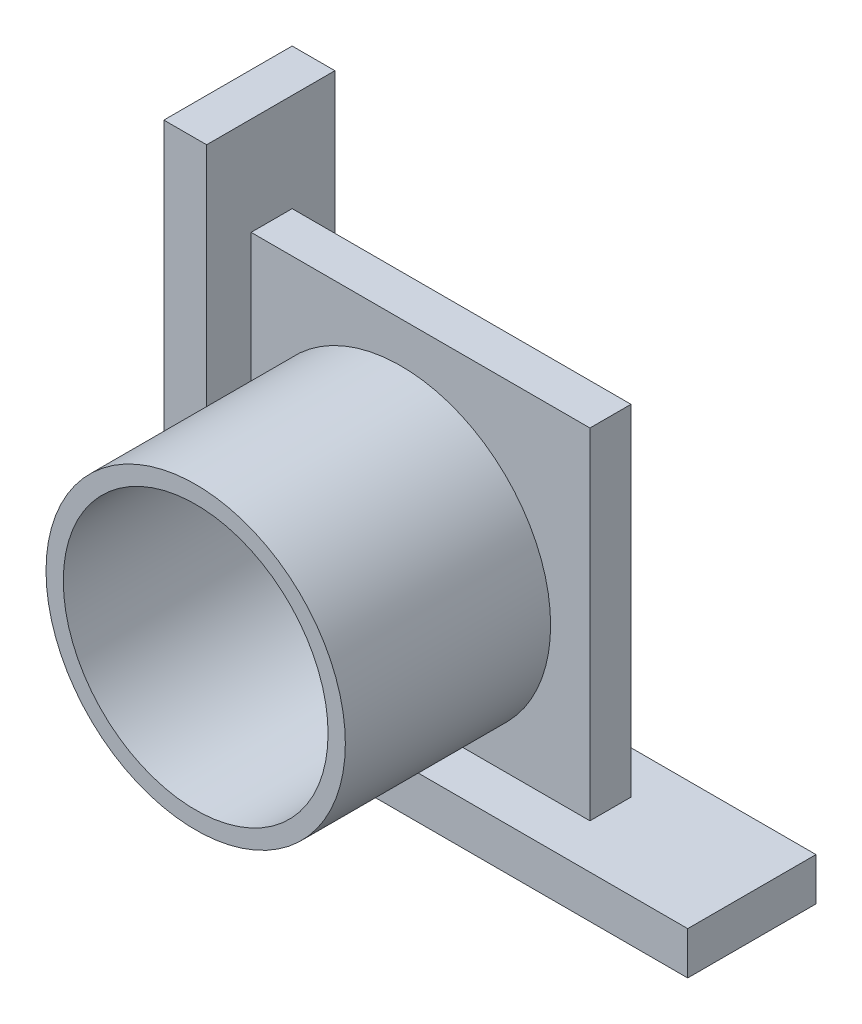
ISO-10303-21;
HEADER;
FILE_DESCRIPTION(('STEP AP214'),'2;1');
FILE_NAME('part.step','',(''),(''),'','','');
FILE_SCHEMA(('AUTOMOTIVE_DESIGN { 1 0 10303 214 1 1 1 1 }'));
ENDSEC;
DATA;
#1=APPLICATION_CONTEXT('core data for automotive mechanical design processes');
#2=APPLICATION_PROTOCOL_DEFINITION('international standard','automotive_design',2000,#1);
#3=PRODUCT_CONTEXT('',#1,'mechanical');
#4=PRODUCT('Part','Part','',(#3));
#5=PRODUCT_RELATED_PRODUCT_CATEGORY('part','',(#4));
#6=PRODUCT_DEFINITION_FORMATION('','',#4);
#7=PRODUCT_DEFINITION_CONTEXT('part definition',#1,'design');
#8=PRODUCT_DEFINITION('design','',#6,#7);
#9=PRODUCT_DEFINITION_SHAPE('','',#8);
#10=(LENGTH_UNIT() NAMED_UNIT(*) SI_UNIT(.MILLI.,.METRE.));
#11=(NAMED_UNIT(*) PLANE_ANGLE_UNIT() SI_UNIT($,.RADIAN.));
#12=(NAMED_UNIT(*) SI_UNIT($,.STERADIAN.) SOLID_ANGLE_UNIT());
#13=UNCERTAINTY_MEASURE_WITH_UNIT(LENGTH_MEASURE(1.E-05),#10,'distance_accuracy_value','');
#14=(GEOMETRIC_REPRESENTATION_CONTEXT(3) GLOBAL_UNCERTAINTY_ASSIGNED_CONTEXT((#13)) GLOBAL_UNIT_ASSIGNED_CONTEXT((#10,
#11,#12)) REPRESENTATION_CONTEXT('',''));
#15=CARTESIAN_POINT('',(0.,0.,0.));
#16=DIRECTION('',(0.,0.,1.));
#17=DIRECTION('',(1.,0.,0.));
#18=AXIS2_PLACEMENT_3D('',#15,#16,#17);
#19=CARTESIAN_POINT('',(12.7,113.7412,24.892));
#20=DIRECTION('',(0.,0.,-1.));
#21=DIRECTION('',(0.,1.,0.));
#22=AXIS2_PLACEMENT_3D('',#19,#20,#21);
#23=PLANE('',#22);
#24=CARTESIAN_POINT('',(57.2008,57.2008,24.892));
#25=DIRECTION('',(0.,0.,-1.));
#26=DIRECTION('',(0.,1.,0.));
#27=AXIS2_PLACEMENT_3D('',#24,#25,#26);
#28=CIRCLE('',#27,39.3192);
#29=CARTESIAN_POINT('',(53.0149568799239,18.1050431200762,24.892));
#30=VERTEX_POINT('',#29);
#31=CARTESIAN_POINT('',(18.1050431200762,53.0149568799239,24.892));
#32=VERTEX_POINT('',#31);
#33=EDGE_CURVE('E160',#30,#32,#28,.F.);
#34=ORIENTED_EDGE('',*,*,#33,.T.);
#35=DIRECTION('',(-0.707106781186548,0.707106781186548,0.));
#36=VECTOR('',#35,1.);
#37=CARTESIAN_POINT('',(12.7,58.42,24.892));
#38=LINE('',#37,#36);
#39=EDGE_CURVE('E138',#30,#32,#38,.T.);
#40=ORIENTED_EDGE('',*,*,#39,.F.);
#41=EDGE_LOOP('',(#34,#40));
#42=FACE_BOUND('',#41,.T.);
#43=ADVANCED_FACE('F33',(#42),#23,.F.);
#44=CARTESIAN_POINT('',(155.575,12.7,0.));
#45=DIRECTION('',(0.,1.,0.));
#46=DIRECTION('',(0.,0.,1.));
#47=AXIS2_PLACEMENT_3D('',#44,#45,#46);
#48=PLANE('',#47);
#49=DIRECTION('',(1.,0.,0.));
#50=VECTOR('',#49,1.);
#51=CARTESIAN_POINT('',(12.7,12.7,24.892));
#52=LINE('',#51,#50);
#53=CARTESIAN_POINT('',(58.42,12.7,24.892));
#54=VERTEX_POINT('',#53);
#55=CARTESIAN_POINT('',(113.3348,12.7,24.892));
#56=VERTEX_POINT('',#55);
#57=EDGE_CURVE('E166',#54,#56,#52,.T.);
#58=ORIENTED_EDGE('',*,*,#57,.F.);
#59=DIRECTION('',(0.,0.,1.));
#60=VECTOR('',#59,1.);
#61=CARTESIAN_POINT('',(58.42,12.7,-51.9578440716979));
#62=LINE('',#61,#60);
#63=CARTESIAN_POINT('',(58.42,12.7,12.7));
#64=VERTEX_POINT('',#63);
#65=EDGE_CURVE('E58',#64,#54,#62,.T.);
#66=ORIENTED_EDGE('',*,*,#65,.F.);
#67=DIRECTION('',(-1.,0.,0.));
#68=VECTOR('',#67,1.);
#69=CARTESIAN_POINT('',(12.7,12.7,12.7));
#70=LINE('',#69,#68);
#71=CARTESIAN_POINT('',(113.3348,12.7,12.7));
#72=VERTEX_POINT('',#71);
#73=EDGE_CURVE('E179',#72,#64,#70,.T.);
#74=ORIENTED_EDGE('',*,*,#73,.F.);
#75=DIRECTION('',(0.,0.,-1.));
#76=VECTOR('',#75,1.);
#77=CARTESIAN_POINT('',(113.3348,12.7,12.7));
#78=LINE('',#77,#76);
#79=EDGE_CURVE('E169',#56,#72,#78,.T.);
#80=ORIENTED_EDGE('',*,*,#79,.F.);
#81=EDGE_LOOP('',(#58,#66,#74,#80));
#82=FACE_BOUND('',#81,.T.);
#83=DIRECTION('',(-1.,0.,0.));
#84=VECTOR('',#83,1.);
#85=CARTESIAN_POINT('',(155.575,12.7,0.));
#86=LINE('',#85,#84);
#87=CARTESIAN_POINT('',(155.575,12.7,0.));
#88=VERTEX_POINT('',#87);
#89=CARTESIAN_POINT('',(12.7,12.7,0.));
#90=VERTEX_POINT('',#89);
#91=EDGE_CURVE('E42',#88,#90,#86,.T.);
#92=ORIENTED_EDGE('',*,*,#91,.T.);
#93=DIRECTION('',(0.,0.,-1.));
#94=VECTOR('',#93,1.);
#95=CARTESIAN_POINT('',(12.7,12.7,0.));
#96=LINE('',#95,#94);
#97=CARTESIAN_POINT('',(12.7,12.7,38.1));
#98=VERTEX_POINT('',#97);
#99=EDGE_CURVE('E198',#98,#90,#96,.T.);
#100=ORIENTED_EDGE('',*,*,#99,.F.);
#101=DIRECTION('',(-1.,0.,0.));
#102=VECTOR('',#101,1.);
#103=CARTESIAN_POINT('',(155.575,12.7,38.1));
#104=LINE('',#103,#102);
#105=CARTESIAN_POINT('',(155.575,12.7,38.1));
#106=VERTEX_POINT('',#105);
#107=EDGE_CURVE('E237',#106,#98,#104,.T.);
#108=ORIENTED_EDGE('',*,*,#107,.F.);
#109=DIRECTION('',(0.,0.,-1.));
#110=VECTOR('',#109,1.);
#111=CARTESIAN_POINT('',(155.575,12.7,0.));
#112=LINE('',#111,#110);
#113=EDGE_CURVE('E224',#106,#88,#112,.T.);
#114=ORIENTED_EDGE('',*,*,#113,.T.);
#115=EDGE_LOOP('',(#92,#100,#108,#114));
#116=FACE_BOUND('',#115,.T.);
#117=ADVANCED_FACE('F263',(#82,#116),#48,.T.);
#118=CARTESIAN_POINT('',(12.7,142.875,0.));
#119=DIRECTION('',(-1.,0.,0.));
#120=DIRECTION('',(0.,0.,1.));
#121=AXIS2_PLACEMENT_3D('',#118,#119,#120);
#122=PLANE('',#121);
#123=ORIENTED_EDGE('',*,*,#99,.T.);
#124=DIRECTION('',(0.,-1.,0.));
#125=VECTOR('',#124,1.);
#126=CARTESIAN_POINT('',(12.7,142.875,0.));
#127=LINE('',#126,#125);
#128=CARTESIAN_POINT('',(12.7,142.875,0.));
#129=VERTEX_POINT('',#128);
#130=EDGE_CURVE('E209',#129,#90,#127,.T.);
#131=ORIENTED_EDGE('',*,*,#130,.F.);
#132=DIRECTION('',(0.,0.,-1.));
#133=VECTOR('',#132,1.);
#134=CARTESIAN_POINT('',(12.7,142.875,0.));
#135=LINE('',#134,#133);
#136=CARTESIAN_POINT('',(12.7,142.875,38.1));
#137=VERTEX_POINT('',#136);
#138=EDGE_CURVE('E204',#137,#129,#135,.T.);
#139=ORIENTED_EDGE('',*,*,#138,.F.);
#140=DIRECTION('',(0.,-1.,0.));
#141=VECTOR('',#140,1.);
#142=CARTESIAN_POINT('',(12.7,142.875,38.1));
#143=LINE('',#142,#141);
#144=EDGE_CURVE('E213',#137,#98,#143,.T.);
#145=ORIENTED_EDGE('',*,*,#144,.T.);
#146=EDGE_LOOP('',(#123,#131,#139,#145));
#147=FACE_BOUND('',#146,.T.);
#148=DIRECTION('',(0.,-1.,0.));
#149=VECTOR('',#148,1.);
#150=CARTESIAN_POINT('',(12.7,113.7412,24.892));
#151=LINE('',#150,#149);
#152=CARTESIAN_POINT('',(12.7,113.7412,24.892));
#153=VERTEX_POINT('',#152);
#154=CARTESIAN_POINT('',(12.7,58.42,24.892));
#155=VERTEX_POINT('',#154);
#156=EDGE_CURVE('E196',#153,#155,#151,.T.);
#157=ORIENTED_EDGE('',*,*,#156,.F.);
#158=DIRECTION('',(0.,0.,1.));
#159=VECTOR('',#158,1.);
#160=CARTESIAN_POINT('',(12.7,113.7412,12.7));
#161=LINE('',#160,#159);
#162=CARTESIAN_POINT('',(12.7,113.7412,12.7));
#163=VERTEX_POINT('',#162);
#164=EDGE_CURVE('E175',#163,#153,#161,.T.);
#165=ORIENTED_EDGE('',*,*,#164,.F.);
#166=DIRECTION('',(0.,-1.,0.));
#167=VECTOR('',#166,1.);
#168=CARTESIAN_POINT('',(12.7,113.7412,12.7));
#169=LINE('',#168,#167);
#170=CARTESIAN_POINT('',(12.7,58.42,12.7));
#171=VERTEX_POINT('',#170);
#172=EDGE_CURVE('E185',#163,#171,#169,.T.);
#173=ORIENTED_EDGE('',*,*,#172,.T.);
#174=DIRECTION('',(0.,0.,1.));
#175=VECTOR('',#174,1.);
#176=CARTESIAN_POINT('',(12.7,58.42,-51.9578440716979));
#177=LINE('',#176,#175);
#178=EDGE_CURVE('E154',#171,#155,#177,.T.);
#179=ORIENTED_EDGE('',*,*,#178,.T.);
#180=EDGE_LOOP('',(#157,#165,#173,#179));
#181=FACE_BOUND('',#180,.T.);
#182=ADVANCED_FACE('F259',(#147,#181),#122,.F.);
#183=CARTESIAN_POINT('',(155.575,0.,0.));
#184=DIRECTION('',(0.,-1.,0.));
#185=DIRECTION('',(0.,0.,-1.));
#186=AXIS2_PLACEMENT_3D('',#183,#184,#185);
#187=PLANE('',#186);
#188=DIRECTION('',(0.,0.,1.));
#189=VECTOR('',#188,1.);
#190=CARTESIAN_POINT('',(0.,0.,0.));
#191=LINE('',#190,#189);
#192=CARTESIAN_POINT('',(0.,0.,0.));
#193=VERTEX_POINT('',#192);
#194=CARTESIAN_POINT('',(0.,0.,38.1));
#195=VERTEX_POINT('',#194);
#196=EDGE_CURVE('E216',#193,#195,#191,.T.);
#197=ORIENTED_EDGE('',*,*,#196,.F.);
#198=DIRECTION('',(-1.,0.,0.));
#199=VECTOR('',#198,1.);
#200=CARTESIAN_POINT('',(155.575,0.,0.));
#201=LINE('',#200,#199);
#202=CARTESIAN_POINT('',(155.575,0.,0.));
#203=VERTEX_POINT('',#202);
#204=EDGE_CURVE('E11',#203,#193,#201,.T.);
#205=ORIENTED_EDGE('',*,*,#204,.F.);
#206=DIRECTION('',(0.,0.,1.));
#207=VECTOR('',#206,1.);
#208=CARTESIAN_POINT('',(155.575,0.,0.));
#209=LINE('',#208,#207);
#210=CARTESIAN_POINT('',(155.575,0.,38.1));
#211=VERTEX_POINT('',#210);
#212=EDGE_CURVE('E217',#203,#211,#209,.T.);
#213=ORIENTED_EDGE('',*,*,#212,.T.);
#214=DIRECTION('',(-1.,0.,0.));
#215=VECTOR('',#214,1.);
#216=CARTESIAN_POINT('',(155.575,0.,38.1));
#217=LINE('',#216,#215);
#218=EDGE_CURVE('E37',#211,#195,#217,.T.);
#219=ORIENTED_EDGE('',*,*,#218,.T.);
#220=EDGE_LOOP('',(#197,#205,#213,#219));
#221=FACE_BOUND('',#220,.T.);
#222=ADVANCED_FACE('F35',(#221),#187,.T.);
#223=CARTESIAN_POINT('',(155.575,0.,0.));
#224=DIRECTION('',(0.,0.,-1.));
#225=DIRECTION('',(-1.,0.,0.));
#226=AXIS2_PLACEMENT_3D('',#223,#224,#225);
#227=PLANE('',#226);
#228=DIRECTION('',(0.,-1.,0.));
#229=VECTOR('',#228,1.);
#230=CARTESIAN_POINT('',(0.,0.,0.));
#231=LINE('',#230,#229);
#232=CARTESIAN_POINT('',(0.,142.875,0.));
#233=VERTEX_POINT('',#232);
#234=EDGE_CURVE('E221',#233,#193,#231,.T.);
#235=ORIENTED_EDGE('',*,*,#234,.F.);
#236=DIRECTION('',(-1.,0.,0.));
#237=VECTOR('',#236,1.);
#238=CARTESIAN_POINT('',(0.,142.875,0.));
#239=LINE('',#238,#237);
#240=EDGE_CURVE('E206',#129,#233,#239,.T.);
#241=ORIENTED_EDGE('',*,*,#240,.F.);
#242=ORIENTED_EDGE('',*,*,#130,.T.);
#243=ORIENTED_EDGE('',*,*,#91,.F.);
#244=DIRECTION('',(0.,-1.,0.));
#245=VECTOR('',#244,1.);
#246=CARTESIAN_POINT('',(155.575,0.,0.));
#247=LINE('',#246,#245);
#248=EDGE_CURVE('E227',#88,#203,#247,.T.);
#249=ORIENTED_EDGE('',*,*,#248,.T.);
#250=ORIENTED_EDGE('',*,*,#204,.T.);
#251=EDGE_LOOP('',(#235,#241,#242,#243,#249,#250));
#252=FACE_BOUND('',#251,.T.);
#253=ADVANCED_FACE('F253',(#252),#227,.T.);
#254=CARTESIAN_POINT('',(155.575,0.,38.1));
#255=DIRECTION('',(0.,0.,1.));
#256=DIRECTION('',(1.,0.,0.));
#257=AXIS2_PLACEMENT_3D('',#254,#255,#256);
#258=PLANE('',#257);
#259=DIRECTION('',(0.,1.,0.));
#260=VECTOR('',#259,1.);
#261=CARTESIAN_POINT('',(0.,0.,38.1));
#262=LINE('',#261,#260);
#263=CARTESIAN_POINT('',(0.,142.875,38.1));
#264=VERTEX_POINT('',#263);
#265=EDGE_CURVE('E232',#195,#264,#262,.T.);
#266=ORIENTED_EDGE('',*,*,#265,.F.);
#267=ORIENTED_EDGE('',*,*,#218,.F.);
#268=DIRECTION('',(0.,1.,0.));
#269=VECTOR('',#268,1.);
#270=CARTESIAN_POINT('',(155.575,0.,38.1));
#271=LINE('',#270,#269);
#272=EDGE_CURVE('E220',#211,#106,#271,.T.);
#273=ORIENTED_EDGE('',*,*,#272,.T.);
#274=ORIENTED_EDGE('',*,*,#107,.T.);
#275=ORIENTED_EDGE('',*,*,#144,.F.);
#276=DIRECTION('',(1.,0.,0.));
#277=VECTOR('',#276,1.);
#278=CARTESIAN_POINT('',(0.,142.875,38.1));
#279=LINE('',#278,#277);
#280=EDGE_CURVE('E202',#264,#137,#279,.T.);
#281=ORIENTED_EDGE('',*,*,#280,.F.);
#282=EDGE_LOOP('',(#266,#267,#273,#274,#275,#281));
#283=FACE_BOUND('',#282,.T.);
#284=ADVANCED_FACE('F247',(#283),#258,.T.);
#285=CARTESIAN_POINT('',(155.575,0.,0.));
#286=DIRECTION('',(-1.,0.,0.));
#287=DIRECTION('',(0.,0.,1.));
#288=AXIS2_PLACEMENT_3D('',#285,#286,#287);
#289=PLANE('',#288);
#290=ORIENTED_EDGE('',*,*,#212,.F.);
#291=ORIENTED_EDGE('',*,*,#248,.F.);
#292=ORIENTED_EDGE('',*,*,#113,.F.);
#293=ORIENTED_EDGE('',*,*,#272,.F.);
#294=EDGE_LOOP('',(#290,#291,#292,#293));
#295=FACE_BOUND('',#294,.T.);
#296=ADVANCED_FACE('F265',(#295),#289,.F.);
#297=CARTESIAN_POINT('',(0.,0.,0.));
#298=DIRECTION('',(-1.,0.,0.));
#299=DIRECTION('',(0.,0.,1.));
#300=AXIS2_PLACEMENT_3D('',#297,#298,#299);
#301=PLANE('',#300);
#302=ORIENTED_EDGE('',*,*,#196,.T.);
#303=ORIENTED_EDGE('',*,*,#265,.T.);
#304=DIRECTION('',(0.,0.,1.));
#305=VECTOR('',#304,1.);
#306=CARTESIAN_POINT('',(0.,142.875,0.));
#307=LINE('',#306,#305);
#308=EDGE_CURVE('E199',#233,#264,#307,.T.);
#309=ORIENTED_EDGE('',*,*,#308,.F.);
#310=ORIENTED_EDGE('',*,*,#234,.T.);
#311=EDGE_LOOP('',(#302,#303,#309,#310));
#312=FACE_BOUND('',#311,.T.);
#313=ADVANCED_FACE('F250',(#312),#301,.T.);
#314=CARTESIAN_POINT('',(0.,142.875,0.));
#315=DIRECTION('',(0.,1.,0.));
#316=DIRECTION('',(0.,0.,1.));
#317=AXIS2_PLACEMENT_3D('',#314,#315,#316);
#318=PLANE('',#317);
#319=ORIENTED_EDGE('',*,*,#308,.T.);
#320=ORIENTED_EDGE('',*,*,#280,.T.);
#321=ORIENTED_EDGE('',*,*,#138,.T.);
#322=ORIENTED_EDGE('',*,*,#240,.T.);
#323=EDGE_LOOP('',(#319,#320,#321,#322));
#324=FACE_BOUND('',#323,.T.);
#325=ADVANCED_FACE('F255',(#324),#318,.T.);
#326=CARTESIAN_POINT('',(12.7657677172492,58.3542322827508,24.892));
#327=VERTEX_POINT('',#326);
#328=EDGE_CURVE('E151',#327,#155,#38,.T.);
#329=ORIENTED_EDGE('',*,*,#328,.F.);
#330=CARTESIAN_POINT('',(57.2008,57.2008,24.892));
#331=DIRECTION('',(0.,0.,-1.));
#332=DIRECTION('',(0.,1.,0.));
#333=AXIS2_PLACEMENT_3D('',#330,#331,#332);
#334=CIRCLE('',#333,44.45);
#335=CARTESIAN_POINT('',(58.3542322827508,12.7657677172492,24.892));
#336=VERTEX_POINT('',#335);
#337=EDGE_CURVE('E143',#336,#327,#334,.F.);
#338=ORIENTED_EDGE('',*,*,#337,.F.);
#339=EDGE_CURVE('E137',#54,#336,#38,.T.);
#340=ORIENTED_EDGE('',*,*,#339,.F.);
#341=ORIENTED_EDGE('',*,*,#57,.T.);
#342=DIRECTION('',(0.,-1.,0.));
#343=VECTOR('',#342,1.);
#344=CARTESIAN_POINT('',(113.3348,113.7412,24.892));
#345=LINE('',#344,#343);
#346=CARTESIAN_POINT('',(113.3348,113.7412,24.892));
#347=VERTEX_POINT('',#346);
#348=EDGE_CURVE('E193',#347,#56,#345,.T.);
#349=ORIENTED_EDGE('',*,*,#348,.F.);
#350=DIRECTION('',(1.,0.,0.));
#351=VECTOR('',#350,1.);
#352=CARTESIAN_POINT('',(12.7,113.7412,24.892));
#353=LINE('',#352,#351);
#354=EDGE_CURVE('E178',#153,#347,#353,.T.);
#355=ORIENTED_EDGE('',*,*,#354,.F.);
#356=ORIENTED_EDGE('',*,*,#156,.T.);
#357=EDGE_LOOP('',(#329,#338,#340,#341,#349,#355,#356));
#358=FACE_BOUND('',#357,.T.);
#359=ADVANCED_FACE('F149',(#358),#23,.F.);
#360=CARTESIAN_POINT('',(113.3348,113.7412,12.7));
#361=DIRECTION('',(-1.,0.,0.));
#362=DIRECTION('',(0.,0.,1.));
#363=AXIS2_PLACEMENT_3D('',#360,#361,#362);
#364=PLANE('',#363);
#365=ORIENTED_EDGE('',*,*,#79,.T.);
#366=DIRECTION('',(0.,-1.,0.));
#367=VECTOR('',#366,1.);
#368=CARTESIAN_POINT('',(113.3348,113.7412,12.7));
#369=LINE('',#368,#367);
#370=CARTESIAN_POINT('',(113.3348,113.7412,12.7));
#371=VERTEX_POINT('',#370);
#372=EDGE_CURVE('E190',#371,#72,#369,.T.);
#373=ORIENTED_EDGE('',*,*,#372,.F.);
#374=DIRECTION('',(0.,0.,-1.));
#375=VECTOR('',#374,1.);
#376=CARTESIAN_POINT('',(113.3348,113.7412,12.7));
#377=LINE('',#376,#375);
#378=EDGE_CURVE('E181',#347,#371,#377,.T.);
#379=ORIENTED_EDGE('',*,*,#378,.F.);
#380=ORIENTED_EDGE('',*,*,#348,.T.);
#381=EDGE_LOOP('',(#365,#373,#379,#380));
#382=FACE_BOUND('',#381,.T.);
#383=ADVANCED_FACE('F284',(#382),#364,.F.);
#384=CARTESIAN_POINT('',(12.7,113.7412,12.7));
#385=DIRECTION('',(0.,0.,1.));
#386=DIRECTION('',(0.,-1.,0.));
#387=AXIS2_PLACEMENT_3D('',#384,#385,#386);
#388=PLANE('',#387);
#389=ORIENTED_EDGE('',*,*,#73,.T.);
#390=DIRECTION('',(0.707106781186548,-0.707106781186548,0.));
#391=VECTOR('',#390,1.);
#392=CARTESIAN_POINT('',(12.7,58.42,12.7));
#393=LINE('',#392,#391);
#394=EDGE_CURVE('E165',#171,#64,#393,.T.);
#395=ORIENTED_EDGE('',*,*,#394,.F.);
#396=ORIENTED_EDGE('',*,*,#172,.F.);
#397=DIRECTION('',(-1.,0.,0.));
#398=VECTOR('',#397,1.);
#399=CARTESIAN_POINT('',(12.7,113.7412,12.7));
#400=LINE('',#399,#398);
#401=EDGE_CURVE('E183',#371,#163,#400,.T.);
#402=ORIENTED_EDGE('',*,*,#401,.F.);
#403=ORIENTED_EDGE('',*,*,#372,.T.);
#404=EDGE_LOOP('',(#389,#395,#396,#402,#403));
#405=FACE_BOUND('',#404,.T.);
#406=ADVANCED_FACE('F289',(#405),#388,.F.);
#407=CARTESIAN_POINT('',(0.,113.7412,0.));
#408=DIRECTION('',(0.,1.,0.));
#409=DIRECTION('',(0.,0.,1.));
#410=AXIS2_PLACEMENT_3D('',#407,#408,#409);
#411=PLANE('',#410);
#412=ORIENTED_EDGE('',*,*,#164,.T.);
#413=ORIENTED_EDGE('',*,*,#354,.T.);
#414=ORIENTED_EDGE('',*,*,#378,.T.);
#415=ORIENTED_EDGE('',*,*,#401,.T.);
#416=EDGE_LOOP('',(#412,#413,#414,#415));
#417=FACE_BOUND('',#416,.T.);
#418=ADVANCED_FACE('F334',(#417),#411,.T.);
#419=CARTESIAN_POINT('',(12.7,58.42,-51.9578440716979));
#420=DIRECTION('',(0.707106781186548,0.707106781186548,0.));
#421=DIRECTION('',(-0.707106781186548,0.707106781186548,0.));
#422=AXIS2_PLACEMENT_3D('',#419,#420,#421);
#423=PLANE('',#422);
#424=ORIENTED_EDGE('',*,*,#394,.T.);
#425=ORIENTED_EDGE('',*,*,#65,.T.);
#426=ORIENTED_EDGE('',*,*,#339,.T.);
#427=EDGE_CURVE('E129',#336,#30,#38,.T.);
#428=ORIENTED_EDGE('',*,*,#427,.T.);
#429=ORIENTED_EDGE('',*,*,#39,.T.);
#430=EDGE_CURVE('E158',#32,#327,#38,.T.);
#431=ORIENTED_EDGE('',*,*,#430,.T.);
#432=ORIENTED_EDGE('',*,*,#328,.T.);
#433=ORIENTED_EDGE('',*,*,#178,.F.);
#434=EDGE_LOOP('',(#424,#425,#426,#428,#429,#431,#432,#433));
#435=FACE_BOUND('',#434,.T.);
#436=ADVANCED_FACE('F153',(#435),#423,.F.);
#437=CARTESIAN_POINT('',(12.7,113.7412,24.892));
#438=DIRECTION('',(0.,0.,-1.));
#439=DIRECTION('',(0.,1.,0.));
#440=AXIS2_PLACEMENT_3D('',#437,#438,#439);
#441=PLANE('',#440);
#442=ORIENTED_EDGE('',*,*,#427,.F.);
#443=EDGE_CURVE('E50',#327,#336,#334,.F.);
#444=ORIENTED_EDGE('',*,*,#443,.F.);
#445=ORIENTED_EDGE('',*,*,#430,.F.);
#446=EDGE_CURVE('E132',#32,#30,#28,.F.);
#447=ORIENTED_EDGE('',*,*,#446,.T.);
#448=EDGE_LOOP('',(#442,#444,#445,#447));
#449=FACE_BOUND('',#448,.T.);
#450=ADVANCED_FACE('F130',(#449),#441,.T.);
#451=CARTESIAN_POINT('',(57.2008,57.2008,-100.831585694968));
#452=DIRECTION('',(0.,0.,1.));
#453=DIRECTION('',(1.,0.,0.));
#454=AXIS2_PLACEMENT_3D('',#451,#452,#453);
#455=CYLINDRICAL_SURFACE('',#454,44.45);
#456=CARTESIAN_POINT('',(57.2008,57.2008,85.852));
#457=DIRECTION('',(0.,0.,1.));
#458=DIRECTION('',(1.,0.,0.));
#459=AXIS2_PLACEMENT_3D('',#456,#457,#458);
#460=CIRCLE('',#459,44.45);
#461=CARTESIAN_POINT('',(101.6508,57.2008,85.852));
#462=VERTEX_POINT('',#461);
#463=EDGE_CURVE('E163',#462,#462,#460,.T.);
#464=ORIENTED_EDGE('',*,*,#463,.F.);
#465=EDGE_LOOP('',(#464));
#466=FACE_BOUND('',#465,.T.);
#467=ORIENTED_EDGE('',*,*,#443,.T.);
#468=ORIENTED_EDGE('',*,*,#337,.T.);
#469=EDGE_LOOP('',(#467,#468));
#470=FACE_BOUND('',#469,.T.);
#471=ADVANCED_FACE('F142',(#466,#470),#455,.T.);
#472=CARTESIAN_POINT('',(57.2008,57.2008,-100.831585694968));
#473=DIRECTION('',(0.,0.,1.));
#474=DIRECTION('',(1.,0.,0.));
#475=AXIS2_PLACEMENT_3D('',#472,#473,#474);
#476=CYLINDRICAL_SURFACE('',#475,39.3192);
#477=CARTESIAN_POINT('',(57.2008,57.2008,85.852));
#478=DIRECTION('',(0.,0.,1.));
#479=DIRECTION('',(1.,0.,0.));
#480=AXIS2_PLACEMENT_3D('',#477,#478,#479);
#481=CIRCLE('',#480,39.3192);
#482=CARTESIAN_POINT('',(96.52,57.2008,85.852));
#483=VERTEX_POINT('',#482);
#484=EDGE_CURVE('E145',#483,#483,#481,.T.);
#485=ORIENTED_EDGE('',*,*,#484,.T.);
#486=EDGE_LOOP('',(#485));
#487=FACE_BOUND('',#486,.T.);
#488=ORIENTED_EDGE('',*,*,#446,.F.);
#489=ORIENTED_EDGE('',*,*,#33,.F.);
#490=EDGE_LOOP('',(#488,#489));
#491=FACE_BOUND('',#490,.T.);
#492=ADVANCED_FACE('F389',(#487,#491),#476,.F.);
#493=CARTESIAN_POINT('',(57.2008,57.2008,85.852));
#494=DIRECTION('',(0.,0.,1.));
#495=DIRECTION('',(1.,0.,0.));
#496=AXIS2_PLACEMENT_3D('',#493,#494,#495);
#497=PLANE('',#496);
#498=ORIENTED_EDGE('',*,*,#484,.F.);
#499=EDGE_LOOP('',(#498));
#500=FACE_BOUND('',#499,.T.);
#501=ORIENTED_EDGE('',*,*,#463,.T.);
#502=EDGE_LOOP('',(#501));
#503=FACE_BOUND('',#502,.T.);
#504=ADVANCED_FACE('F399',(#500,#503),#497,.T.);
#505=CLOSED_SHELL('',(#43,#117,#182,#222,#253,#284,#296,#313,#325,#359,#383,#406,#418,#436,#450,
#471,#492,#504));
#506=MANIFOLD_SOLID_BREP('B2',#505);
#507=ADVANCED_BREP_SHAPE_REPRESENTATION('',(#18,#506),#14);
#508=SHAPE_DEFINITION_REPRESENTATION(#9,#507);
ENDSEC;
END-ISO-10303-21;
